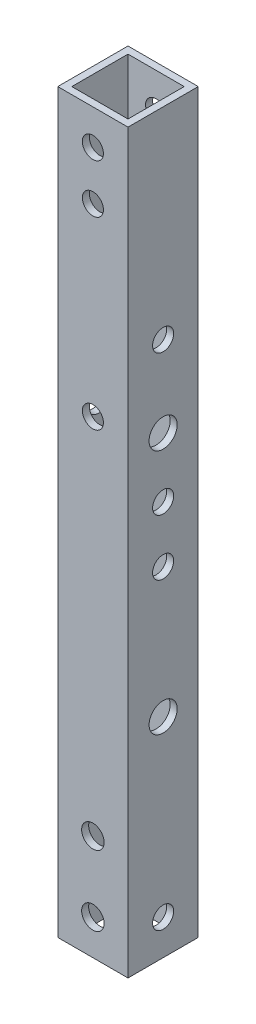
ISO-10303-21;
HEADER;
FILE_DESCRIPTION(('STEP AP214'),'2;1');
FILE_NAME('part.step','',(''),(''),'','','');
FILE_SCHEMA(('AUTOMOTIVE_DESIGN { 1 0 10303 214 1 1 1 1 }'));
ENDSEC;
DATA;
#1=APPLICATION_CONTEXT('core data for automotive mechanical design processes');
#2=APPLICATION_PROTOCOL_DEFINITION('international standard','automotive_design',2000,#1);
#3=PRODUCT_CONTEXT('',#1,'mechanical');
#4=PRODUCT('Part','Part','',(#3));
#5=PRODUCT_RELATED_PRODUCT_CATEGORY('part','',(#4));
#6=PRODUCT_DEFINITION_FORMATION('','',#4);
#7=PRODUCT_DEFINITION_CONTEXT('part definition',#1,'design');
#8=PRODUCT_DEFINITION('design','',#6,#7);
#9=PRODUCT_DEFINITION_SHAPE('','',#8);
#10=(LENGTH_UNIT() NAMED_UNIT(*) SI_UNIT(.MILLI.,.METRE.));
#11=(NAMED_UNIT(*) PLANE_ANGLE_UNIT() SI_UNIT($,.RADIAN.));
#12=(NAMED_UNIT(*) SI_UNIT($,.STERADIAN.) SOLID_ANGLE_UNIT());
#13=UNCERTAINTY_MEASURE_WITH_UNIT(LENGTH_MEASURE(1.E-05),#10,'distance_accuracy_value','');
#14=(GEOMETRIC_REPRESENTATION_CONTEXT(3) GLOBAL_UNCERTAINTY_ASSIGNED_CONTEXT((#13)) GLOBAL_UNIT_ASSIGNED_CONTEXT((#10,
#11,#12)) REPRESENTATION_CONTEXT('',''));
#15=CARTESIAN_POINT('',(0.,0.,0.));
#16=DIRECTION('',(0.,0.,1.));
#17=DIRECTION('',(1.,0.,0.));
#18=AXIS2_PLACEMENT_3D('',#15,#16,#17);
#19=CARTESIAN_POINT('',(0.,104.9,0.));
#20=DIRECTION('',(0.,1.,0.));
#21=DIRECTION('',(0.,0.,1.));
#22=AXIS2_PLACEMENT_3D('',#19,#20,#21);
#23=PLANE('',#22);
#24=DIRECTION('',(0.,0.,-1.));
#25=VECTOR('',#24,1.);
#26=CARTESIAN_POINT('',(5.,104.9,5.));
#27=LINE('',#26,#25);
#28=CARTESIAN_POINT('',(5.,104.9,5.));
#29=VERTEX_POINT('',#28);
#30=CARTESIAN_POINT('',(5.,104.9,-5.));
#31=VERTEX_POINT('',#30);
#32=EDGE_CURVE('E162',#29,#31,#27,.T.);
#33=ORIENTED_EDGE('',*,*,#32,.T.);
#34=DIRECTION('',(-1.,0.,0.));
#35=VECTOR('',#34,1.);
#36=CARTESIAN_POINT('',(-5.,104.9,-5.));
#37=LINE('',#36,#35);
#38=CARTESIAN_POINT('',(-5.,104.9,-5.));
#39=VERTEX_POINT('',#38);
#40=EDGE_CURVE('E165',#31,#39,#37,.T.);
#41=ORIENTED_EDGE('',*,*,#40,.T.);
#42=DIRECTION('',(0.,0.,1.));
#43=VECTOR('',#42,1.);
#44=CARTESIAN_POINT('',(-5.,104.9,5.));
#45=LINE('',#44,#43);
#46=CARTESIAN_POINT('',(-5.,104.9,5.));
#47=VERTEX_POINT('',#46);
#48=EDGE_CURVE('E168',#39,#47,#45,.T.);
#49=ORIENTED_EDGE('',*,*,#48,.T.);
#50=DIRECTION('',(1.,0.,0.));
#51=VECTOR('',#50,1.);
#52=CARTESIAN_POINT('',(-5.,104.9,5.));
#53=LINE('',#52,#51);
#54=EDGE_CURVE('E170',#47,#29,#53,.T.);
#55=ORIENTED_EDGE('',*,*,#54,.T.);
#56=EDGE_LOOP('',(#33,#41,#49,#55));
#57=FACE_BOUND('',#56,.T.);
#58=DIRECTION('',(-1.,0.,0.));
#59=VECTOR('',#58,1.);
#60=CARTESIAN_POINT('',(0.,104.9,-4.));
#61=LINE('',#60,#59);
#62=CARTESIAN_POINT('',(4.,104.9,-4.));
#63=VERTEX_POINT('',#62);
#64=CARTESIAN_POINT('',(-4.,104.9,-4.));
#65=VERTEX_POINT('',#64);
#66=EDGE_CURVE('E132',#63,#65,#61,.T.);
#67=ORIENTED_EDGE('',*,*,#66,.F.);
#68=DIRECTION('',(0.,0.,-1.));
#69=VECTOR('',#68,1.);
#70=CARTESIAN_POINT('',(4.,104.9,0.));
#71=LINE('',#70,#69);
#72=CARTESIAN_POINT('',(4.,104.9,4.));
#73=VERTEX_POINT('',#72);
#74=EDGE_CURVE('E124',#73,#63,#71,.T.);
#75=ORIENTED_EDGE('',*,*,#74,.F.);
#76=DIRECTION('',(1.,0.,0.));
#77=VECTOR('',#76,1.);
#78=CARTESIAN_POINT('',(0.,104.9,4.));
#79=LINE('',#78,#77);
#80=CARTESIAN_POINT('',(-4.,104.9,4.));
#81=VERTEX_POINT('',#80);
#82=EDGE_CURVE('E146',#81,#73,#79,.T.);
#83=ORIENTED_EDGE('',*,*,#82,.F.);
#84=DIRECTION('',(0.,0.,1.));
#85=VECTOR('',#84,1.);
#86=CARTESIAN_POINT('',(-4.,104.9,0.));
#87=LINE('',#86,#85);
#88=EDGE_CURVE('E144',#65,#81,#87,.T.);
#89=ORIENTED_EDGE('',*,*,#88,.F.);
#90=EDGE_LOOP('',(#67,#75,#83,#89));
#91=FACE_BOUND('',#90,.T.);
#92=ADVANCED_FACE('F57',(#57,#91),#23,.T.);
#93=CARTESIAN_POINT('',(0.,0.,0.));
#94=DIRECTION('',(0.,1.,0.));
#95=DIRECTION('',(0.,0.,1.));
#96=AXIS2_PLACEMENT_3D('',#93,#94,#95);
#97=PLANE('',#96);
#98=DIRECTION('',(0.,0.,-1.));
#99=VECTOR('',#98,1.);
#100=CARTESIAN_POINT('',(5.,0.,5.));
#101=LINE('',#100,#99);
#102=CARTESIAN_POINT('',(5.,0.,5.));
#103=VERTEX_POINT('',#102);
#104=CARTESIAN_POINT('',(5.,0.,-5.));
#105=VERTEX_POINT('',#104);
#106=EDGE_CURVE('E140',#103,#105,#101,.T.);
#107=ORIENTED_EDGE('',*,*,#106,.F.);
#108=DIRECTION('',(1.,0.,0.));
#109=VECTOR('',#108,1.);
#110=CARTESIAN_POINT('',(-5.,0.,5.));
#111=LINE('',#110,#109);
#112=CARTESIAN_POINT('',(-5.,0.,5.));
#113=VERTEX_POINT('',#112);
#114=EDGE_CURVE('E166',#113,#103,#111,.T.);
#115=ORIENTED_EDGE('',*,*,#114,.F.);
#116=DIRECTION('',(0.,0.,1.));
#117=VECTOR('',#116,1.);
#118=CARTESIAN_POINT('',(-5.,0.,5.));
#119=LINE('',#118,#117);
#120=CARTESIAN_POINT('',(-5.,0.,-5.));
#121=VERTEX_POINT('',#120);
#122=EDGE_CURVE('E177',#121,#113,#119,.T.);
#123=ORIENTED_EDGE('',*,*,#122,.F.);
#124=DIRECTION('',(-1.,0.,0.));
#125=VECTOR('',#124,1.);
#126=CARTESIAN_POINT('',(-5.,0.,-5.));
#127=LINE('',#126,#125);
#128=EDGE_CURVE('E175',#105,#121,#127,.T.);
#129=ORIENTED_EDGE('',*,*,#128,.F.);
#130=EDGE_LOOP('',(#107,#115,#123,#129));
#131=FACE_BOUND('',#130,.T.);
#132=DIRECTION('',(0.,0.,-1.));
#133=VECTOR('',#132,1.);
#134=CARTESIAN_POINT('',(4.,0.,0.));
#135=LINE('',#134,#133);
#136=CARTESIAN_POINT('',(4.,0.,4.));
#137=VERTEX_POINT('',#136);
#138=CARTESIAN_POINT('',(4.,0.,-4.));
#139=VERTEX_POINT('',#138);
#140=EDGE_CURVE('E82',#137,#139,#135,.T.);
#141=ORIENTED_EDGE('',*,*,#140,.T.);
#142=DIRECTION('',(-1.,0.,0.));
#143=VECTOR('',#142,1.);
#144=CARTESIAN_POINT('',(0.,0.,-4.));
#145=LINE('',#144,#143);
#146=CARTESIAN_POINT('',(-4.,0.,-4.));
#147=VERTEX_POINT('',#146);
#148=EDGE_CURVE('E139',#139,#147,#145,.T.);
#149=ORIENTED_EDGE('',*,*,#148,.T.);
#150=DIRECTION('',(0.,0.,1.));
#151=VECTOR('',#150,1.);
#152=CARTESIAN_POINT('',(-4.,0.,0.));
#153=LINE('',#152,#151);
#154=CARTESIAN_POINT('',(-4.,0.,4.));
#155=VERTEX_POINT('',#154);
#156=EDGE_CURVE('E154',#147,#155,#153,.T.);
#157=ORIENTED_EDGE('',*,*,#156,.T.);
#158=DIRECTION('',(1.,0.,0.));
#159=VECTOR('',#158,1.);
#160=CARTESIAN_POINT('',(0.,0.,4.));
#161=LINE('',#160,#159);
#162=EDGE_CURVE('E133',#155,#137,#161,.T.);
#163=ORIENTED_EDGE('',*,*,#162,.T.);
#164=EDGE_LOOP('',(#141,#149,#157,#163));
#165=FACE_BOUND('',#164,.T.);
#166=ADVANCED_FACE('F317',(#131,#165),#97,.F.);
#167=CARTESIAN_POINT('',(5.,104.9,5.));
#168=DIRECTION('',(-1.,0.,0.));
#169=DIRECTION('',(0.,0.,1.));
#170=AXIS2_PLACEMENT_3D('',#167,#168,#169);
#171=PLANE('',#170);
#172=CARTESIAN_POINT('',(5.,5.,0.));
#173=DIRECTION('',(1.,0.,0.));
#174=DIRECTION('',(0.,0.,-1.));
#175=AXIS2_PLACEMENT_3D('',#172,#173,#174);
#176=CIRCLE('',#175,1.5);
#177=CARTESIAN_POINT('',(5.,5.,-1.5));
#178=VERTEX_POINT('',#177);
#179=EDGE_CURVE('E369',#178,#178,#176,.T.);
#180=ORIENTED_EDGE('',*,*,#179,.F.);
#181=EDGE_LOOP('',(#180));
#182=FACE_BOUND('',#181,.T.);
#183=CARTESIAN_POINT('',(5.,29.7,0.));
#184=DIRECTION('',(1.,0.,0.));
#185=DIRECTION('',(0.,0.,-1.));
#186=AXIS2_PLACEMENT_3D('',#183,#184,#185);
#187=CIRCLE('',#186,2.);
#188=CARTESIAN_POINT('',(5.,29.7,-2.));
#189=VERTEX_POINT('',#188);
#190=EDGE_CURVE('E402',#189,#189,#187,.T.);
#191=ORIENTED_EDGE('',*,*,#190,.F.);
#192=EDGE_LOOP('',(#191));
#193=FACE_BOUND('',#192,.T.);
#194=CARTESIAN_POINT('',(5.,76.2,0.));
#195=DIRECTION('',(1.,0.,0.));
#196=DIRECTION('',(0.,0.,-1.));
#197=AXIS2_PLACEMENT_3D('',#194,#195,#196);
#198=CIRCLE('',#197,1.5);
#199=CARTESIAN_POINT('',(5.,76.2,-1.5));
#200=VERTEX_POINT('',#199);
#201=EDGE_CURVE('E406',#200,#200,#198,.T.);
#202=ORIENTED_EDGE('',*,*,#201,.F.);
#203=EDGE_LOOP('',(#202));
#204=FACE_BOUND('',#203,.T.);
#205=CARTESIAN_POINT('',(5.,48.2,0.));
#206=DIRECTION('',(1.,0.,0.));
#207=DIRECTION('',(0.,0.,-1.));
#208=AXIS2_PLACEMENT_3D('',#205,#206,#207);
#209=CIRCLE('',#208,1.5);
#210=CARTESIAN_POINT('',(5.,48.2,-1.5));
#211=VERTEX_POINT('',#210);
#212=EDGE_CURVE('E410',#211,#211,#209,.T.);
#213=ORIENTED_EDGE('',*,*,#212,.F.);
#214=EDGE_LOOP('',(#213));
#215=FACE_BOUND('',#214,.T.);
#216=CARTESIAN_POINT('',(5.,56.2,0.));
#217=DIRECTION('',(1.,0.,0.));
#218=DIRECTION('',(0.,0.,-1.));
#219=AXIS2_PLACEMENT_3D('',#216,#217,#218);
#220=CIRCLE('',#219,1.5);
#221=CARTESIAN_POINT('',(5.,56.2,-1.5));
#222=VERTEX_POINT('',#221);
#223=EDGE_CURVE('E413',#222,#222,#220,.T.);
#224=ORIENTED_EDGE('',*,*,#223,.F.);
#225=EDGE_LOOP('',(#224));
#226=FACE_BOUND('',#225,.T.);
#227=CARTESIAN_POINT('',(5.,64.7,0.));
#228=DIRECTION('',(1.,0.,0.));
#229=DIRECTION('',(0.,0.,-1.));
#230=AXIS2_PLACEMENT_3D('',#227,#228,#229);
#231=CIRCLE('',#230,2.);
#232=CARTESIAN_POINT('',(5.,64.7,-2.));
#233=VERTEX_POINT('',#232);
#234=EDGE_CURVE('E364',#233,#233,#231,.T.);
#235=ORIENTED_EDGE('',*,*,#234,.F.);
#236=EDGE_LOOP('',(#235));
#237=FACE_BOUND('',#236,.T.);
#238=ORIENTED_EDGE('',*,*,#106,.T.);
#239=DIRECTION('',(0.,-1.,0.));
#240=VECTOR('',#239,1.);
#241=CARTESIAN_POINT('',(5.,104.9,-5.));
#242=LINE('',#241,#240);
#243=EDGE_CURVE('E12',#31,#105,#242,.T.);
#244=ORIENTED_EDGE('',*,*,#243,.F.);
#245=ORIENTED_EDGE('',*,*,#32,.F.);
#246=DIRECTION('',(0.,-1.,0.));
#247=VECTOR('',#246,1.);
#248=CARTESIAN_POINT('',(5.,104.9,5.));
#249=LINE('',#248,#247);
#250=EDGE_CURVE('E172',#29,#103,#249,.T.);
#251=ORIENTED_EDGE('',*,*,#250,.T.);
#252=EDGE_LOOP('',(#238,#244,#245,#251));
#253=FACE_BOUND('',#252,.T.);
#254=ADVANCED_FACE('F59',(#182,#193,#204,#215,#226,#237,#253),#171,.F.);
#255=CARTESIAN_POINT('',(-5.,104.9,-5.));
#256=DIRECTION('',(0.,0.,1.));
#257=DIRECTION('',(1.,0.,0.));
#258=AXIS2_PLACEMENT_3D('',#255,#256,#257);
#259=PLANE('',#258);
#260=CARTESIAN_POINT('',(0.,5.,-5.));
#261=DIRECTION('',(0.,0.,1.));
#262=DIRECTION('',(1.,0.,0.));
#263=AXIS2_PLACEMENT_3D('',#260,#261,#262);
#264=CIRCLE('',#263,1.6);
#265=CARTESIAN_POINT('',(1.6,5.,-5.));
#266=VERTEX_POINT('',#265);
#267=EDGE_CURVE('E253',#266,#266,#264,.T.);
#268=ORIENTED_EDGE('',*,*,#267,.T.);
#269=EDGE_LOOP('',(#268));
#270=FACE_BOUND('',#269,.T.);
#271=CARTESIAN_POINT('',(0.,66.7,-5.));
#272=DIRECTION('',(0.,0.,1.));
#273=DIRECTION('',(1.,0.,0.));
#274=AXIS2_PLACEMENT_3D('',#271,#272,#273);
#275=CIRCLE('',#274,1.5);
#276=CARTESIAN_POINT('',(1.5,66.7,-5.));
#277=VERTEX_POINT('',#276);
#278=EDGE_CURVE('E260',#277,#277,#275,.T.);
#279=ORIENTED_EDGE('',*,*,#278,.T.);
#280=EDGE_LOOP('',(#279));
#281=FACE_BOUND('',#280,.T.);
#282=CARTESIAN_POINT('',(0.,99.9,-5.));
#283=DIRECTION('',(0.,0.,1.));
#284=DIRECTION('',(1.,0.,0.));
#285=AXIS2_PLACEMENT_3D('',#282,#283,#284);
#286=CIRCLE('',#285,1.5);
#287=CARTESIAN_POINT('',(1.5,99.9,-5.));
#288=VERTEX_POINT('',#287);
#289=EDGE_CURVE('E241',#288,#288,#286,.T.);
#290=ORIENTED_EDGE('',*,*,#289,.T.);
#291=EDGE_LOOP('',(#290));
#292=FACE_BOUND('',#291,.T.);
#293=CARTESIAN_POINT('',(0.,15.,-5.));
#294=DIRECTION('',(0.,0.,1.));
#295=DIRECTION('',(1.,0.,0.));
#296=AXIS2_PLACEMENT_3D('',#293,#294,#295);
#297=CIRCLE('',#296,1.6);
#298=CARTESIAN_POINT('',(1.6,15.,-5.));
#299=VERTEX_POINT('',#298);
#300=EDGE_CURVE('E248',#299,#299,#297,.T.);
#301=ORIENTED_EDGE('',*,*,#300,.T.);
#302=EDGE_LOOP('',(#301));
#303=FACE_BOUND('',#302,.T.);
#304=CARTESIAN_POINT('',(0.,92.95,-5.));
#305=DIRECTION('',(0.,0.,1.));
#306=DIRECTION('',(1.,0.,0.));
#307=AXIS2_PLACEMENT_3D('',#304,#305,#306);
#308=CIRCLE('',#307,1.5);
#309=CARTESIAN_POINT('',(1.5,92.95,-5.));
#310=VERTEX_POINT('',#309);
#311=EDGE_CURVE('E191',#310,#310,#308,.T.);
#312=ORIENTED_EDGE('',*,*,#311,.T.);
#313=EDGE_LOOP('',(#312));
#314=FACE_BOUND('',#313,.T.);
#315=ORIENTED_EDGE('',*,*,#128,.T.);
#316=DIRECTION('',(0.,-1.,0.));
#317=VECTOR('',#316,1.);
#318=CARTESIAN_POINT('',(-5.,104.9,-5.));
#319=LINE('',#318,#317);
#320=EDGE_CURVE('E66',#39,#121,#319,.T.);
#321=ORIENTED_EDGE('',*,*,#320,.F.);
#322=ORIENTED_EDGE('',*,*,#40,.F.);
#323=ORIENTED_EDGE('',*,*,#243,.T.);
#324=EDGE_LOOP('',(#315,#321,#322,#323));
#325=FACE_BOUND('',#324,.T.);
#326=ADVANCED_FACE('F303',(#270,#281,#292,#303,#314,#325),#259,.F.);
#327=CARTESIAN_POINT('',(-5.,104.9,5.));
#328=DIRECTION('',(1.,0.,0.));
#329=DIRECTION('',(0.,0.,-1.));
#330=AXIS2_PLACEMENT_3D('',#327,#328,#329);
#331=PLANE('',#330);
#332=CARTESIAN_POINT('',(-5.,5.,0.));
#333=DIRECTION('',(1.,0.,0.));
#334=DIRECTION('',(0.,0.,-1.));
#335=AXIS2_PLACEMENT_3D('',#332,#333,#334);
#336=CIRCLE('',#335,1.5);
#337=CARTESIAN_POINT('',(-5.,5.,-1.5));
#338=VERTEX_POINT('',#337);
#339=EDGE_CURVE('E344',#338,#338,#336,.T.);
#340=ORIENTED_EDGE('',*,*,#339,.T.);
#341=EDGE_LOOP('',(#340));
#342=FACE_BOUND('',#341,.T.);
#343=CARTESIAN_POINT('',(-5.,29.7,0.));
#344=DIRECTION('',(1.,0.,0.));
#345=DIRECTION('',(0.,0.,-1.));
#346=AXIS2_PLACEMENT_3D('',#343,#344,#345);
#347=CIRCLE('',#346,2.);
#348=CARTESIAN_POINT('',(-5.,29.7,-2.));
#349=VERTEX_POINT('',#348);
#350=EDGE_CURVE('E348',#349,#349,#347,.T.);
#351=ORIENTED_EDGE('',*,*,#350,.T.);
#352=EDGE_LOOP('',(#351));
#353=FACE_BOUND('',#352,.T.);
#354=CARTESIAN_POINT('',(-5.,76.2,0.));
#355=DIRECTION('',(1.,0.,0.));
#356=DIRECTION('',(0.,0.,-1.));
#357=AXIS2_PLACEMENT_3D('',#354,#355,#356);
#358=CIRCLE('',#357,1.5);
#359=CARTESIAN_POINT('',(-5.,76.2,-1.5));
#360=VERTEX_POINT('',#359);
#361=EDGE_CURVE('E352',#360,#360,#358,.T.);
#362=ORIENTED_EDGE('',*,*,#361,.T.);
#363=EDGE_LOOP('',(#362));
#364=FACE_BOUND('',#363,.T.);
#365=CARTESIAN_POINT('',(-5.,48.2,0.));
#366=DIRECTION('',(1.,0.,0.));
#367=DIRECTION('',(0.,0.,-1.));
#368=AXIS2_PLACEMENT_3D('',#365,#366,#367);
#369=CIRCLE('',#368,1.5);
#370=CARTESIAN_POINT('',(-5.,48.2,-1.5));
#371=VERTEX_POINT('',#370);
#372=EDGE_CURVE('E356',#371,#371,#369,.T.);
#373=ORIENTED_EDGE('',*,*,#372,.T.);
#374=EDGE_LOOP('',(#373));
#375=FACE_BOUND('',#374,.T.);
#376=CARTESIAN_POINT('',(-5.,56.2,0.));
#377=DIRECTION('',(1.,0.,0.));
#378=DIRECTION('',(0.,0.,-1.));
#379=AXIS2_PLACEMENT_3D('',#376,#377,#378);
#380=CIRCLE('',#379,1.5);
#381=CARTESIAN_POINT('',(-5.,56.2,-1.5));
#382=VERTEX_POINT('',#381);
#383=EDGE_CURVE('E360',#382,#382,#380,.T.);
#384=ORIENTED_EDGE('',*,*,#383,.T.);
#385=EDGE_LOOP('',(#384));
#386=FACE_BOUND('',#385,.T.);
#387=CARTESIAN_POINT('',(-5.,64.7,0.));
#388=DIRECTION('',(1.,0.,0.));
#389=DIRECTION('',(0.,0.,-1.));
#390=AXIS2_PLACEMENT_3D('',#387,#388,#389);
#391=CIRCLE('',#390,2.);
#392=CARTESIAN_POINT('',(-5.,64.7,-2.));
#393=VERTEX_POINT('',#392);
#394=EDGE_CURVE('E211',#393,#393,#391,.T.);
#395=ORIENTED_EDGE('',*,*,#394,.T.);
#396=EDGE_LOOP('',(#395));
#397=FACE_BOUND('',#396,.T.);
#398=ORIENTED_EDGE('',*,*,#122,.T.);
#399=DIRECTION('',(0.,-1.,0.));
#400=VECTOR('',#399,1.);
#401=CARTESIAN_POINT('',(-5.,104.9,5.));
#402=LINE('',#401,#400);
#403=EDGE_CURVE('E182',#47,#113,#402,.T.);
#404=ORIENTED_EDGE('',*,*,#403,.F.);
#405=ORIENTED_EDGE('',*,*,#48,.F.);
#406=ORIENTED_EDGE('',*,*,#320,.T.);
#407=EDGE_LOOP('',(#398,#404,#405,#406));
#408=FACE_BOUND('',#407,.T.);
#409=ADVANCED_FACE('F306',(#342,#353,#364,#375,#386,#397,#408),#331,.F.);
#410=CARTESIAN_POINT('',(-5.,104.9,5.));
#411=DIRECTION('',(0.,0.,-1.));
#412=DIRECTION('',(-1.,0.,0.));
#413=AXIS2_PLACEMENT_3D('',#410,#411,#412);
#414=PLANE('',#413);
#415=CARTESIAN_POINT('',(0.,5.,5.));
#416=DIRECTION('',(0.,0.,1.));
#417=DIRECTION('',(1.,0.,0.));
#418=AXIS2_PLACEMENT_3D('',#415,#416,#417);
#419=CIRCLE('',#418,1.6);
#420=CARTESIAN_POINT('',(1.6,5.,5.));
#421=VERTEX_POINT('',#420);
#422=EDGE_CURVE('E257',#421,#421,#419,.T.);
#423=ORIENTED_EDGE('',*,*,#422,.F.);
#424=EDGE_LOOP('',(#423));
#425=FACE_BOUND('',#424,.T.);
#426=CARTESIAN_POINT('',(0.,66.7,5.));
#427=DIRECTION('',(0.,0.,1.));
#428=DIRECTION('',(1.,0.,0.));
#429=AXIS2_PLACEMENT_3D('',#426,#427,#428);
#430=CIRCLE('',#429,1.5);
#431=CARTESIAN_POINT('',(1.5,66.7,5.));
#432=VERTEX_POINT('',#431);
#433=EDGE_CURVE('E244',#432,#432,#430,.T.);
#434=ORIENTED_EDGE('',*,*,#433,.F.);
#435=EDGE_LOOP('',(#434));
#436=FACE_BOUND('',#435,.T.);
#437=CARTESIAN_POINT('',(0.,99.9,5.));
#438=DIRECTION('',(0.,0.,1.));
#439=DIRECTION('',(1.,0.,0.));
#440=AXIS2_PLACEMENT_3D('',#437,#438,#439);
#441=CIRCLE('',#440,1.5);
#442=CARTESIAN_POINT('',(1.5,99.9,5.));
#443=VERTEX_POINT('',#442);
#444=EDGE_CURVE('E245',#443,#443,#441,.T.);
#445=ORIENTED_EDGE('',*,*,#444,.F.);
#446=EDGE_LOOP('',(#445));
#447=FACE_BOUND('',#446,.T.);
#448=CARTESIAN_POINT('',(0.,15.,5.));
#449=DIRECTION('',(0.,0.,1.));
#450=DIRECTION('',(1.,0.,0.));
#451=AXIS2_PLACEMENT_3D('',#448,#449,#450);
#452=CIRCLE('',#451,1.6);
#453=CARTESIAN_POINT('',(1.6,15.,5.));
#454=VERTEX_POINT('',#453);
#455=EDGE_CURVE('E240',#454,#454,#452,.T.);
#456=ORIENTED_EDGE('',*,*,#455,.F.);
#457=EDGE_LOOP('',(#456));
#458=FACE_BOUND('',#457,.T.);
#459=CARTESIAN_POINT('',(0.,92.95,5.));
#460=DIRECTION('',(0.,0.,1.));
#461=DIRECTION('',(1.,0.,0.));
#462=AXIS2_PLACEMENT_3D('',#459,#460,#461);
#463=CIRCLE('',#462,1.5);
#464=CARTESIAN_POINT('',(1.5,92.95,5.));
#465=VERTEX_POINT('',#464);
#466=EDGE_CURVE('E256',#465,#465,#463,.T.);
#467=ORIENTED_EDGE('',*,*,#466,.F.);
#468=EDGE_LOOP('',(#467));
#469=FACE_BOUND('',#468,.T.);
#470=ORIENTED_EDGE('',*,*,#114,.T.);
#471=ORIENTED_EDGE('',*,*,#250,.F.);
#472=ORIENTED_EDGE('',*,*,#54,.F.);
#473=ORIENTED_EDGE('',*,*,#403,.T.);
#474=EDGE_LOOP('',(#470,#471,#472,#473));
#475=FACE_BOUND('',#474,.T.);
#476=ADVANCED_FACE('F321',(#425,#436,#447,#458,#469,#475),#414,.F.);
#477=CARTESIAN_POINT('',(4.,104.9,0.));
#478=DIRECTION('',(-1.,0.,0.));
#479=DIRECTION('',(0.,0.,1.));
#480=AXIS2_PLACEMENT_3D('',#477,#478,#479);
#481=PLANE('',#480);
#482=CARTESIAN_POINT('',(4.,5.,0.));
#483=DIRECTION('',(-1.,0.,0.));
#484=DIRECTION('',(0.,0.,1.));
#485=AXIS2_PLACEMENT_3D('',#482,#483,#484);
#486=CIRCLE('',#485,1.5);
#487=CARTESIAN_POINT('',(4.,5.,1.5));
#488=VERTEX_POINT('',#487);
#489=EDGE_CURVE('E237',#488,#488,#486,.T.);
#490=ORIENTED_EDGE('',*,*,#489,.F.);
#491=EDGE_LOOP('',(#490));
#492=FACE_BOUND('',#491,.T.);
#493=CARTESIAN_POINT('',(4.,29.7,0.));
#494=DIRECTION('',(-1.,0.,0.));
#495=DIRECTION('',(0.,0.,1.));
#496=AXIS2_PLACEMENT_3D('',#493,#494,#495);
#497=CIRCLE('',#496,2.);
#498=CARTESIAN_POINT('',(4.,29.7,2.));
#499=VERTEX_POINT('',#498);
#500=EDGE_CURVE('E225',#499,#499,#497,.T.);
#501=ORIENTED_EDGE('',*,*,#500,.F.);
#502=EDGE_LOOP('',(#501));
#503=FACE_BOUND('',#502,.T.);
#504=CARTESIAN_POINT('',(4.,76.2,0.));
#505=DIRECTION('',(-1.,0.,0.));
#506=DIRECTION('',(0.,0.,1.));
#507=AXIS2_PLACEMENT_3D('',#504,#505,#506);
#508=CIRCLE('',#507,1.5);
#509=CARTESIAN_POINT('',(4.,76.2,1.5));
#510=VERTEX_POINT('',#509);
#511=EDGE_CURVE('E222',#510,#510,#508,.T.);
#512=ORIENTED_EDGE('',*,*,#511,.F.);
#513=EDGE_LOOP('',(#512));
#514=FACE_BOUND('',#513,.T.);
#515=CARTESIAN_POINT('',(4.,48.2,0.));
#516=DIRECTION('',(-1.,0.,0.));
#517=DIRECTION('',(0.,0.,1.));
#518=AXIS2_PLACEMENT_3D('',#515,#516,#517);
#519=CIRCLE('',#518,1.5);
#520=CARTESIAN_POINT('',(4.,48.2,1.5));
#521=VERTEX_POINT('',#520);
#522=EDGE_CURVE('E219',#521,#521,#519,.T.);
#523=ORIENTED_EDGE('',*,*,#522,.F.);
#524=EDGE_LOOP('',(#523));
#525=FACE_BOUND('',#524,.T.);
#526=CARTESIAN_POINT('',(4.,56.2,0.));
#527=DIRECTION('',(-1.,0.,0.));
#528=DIRECTION('',(0.,0.,1.));
#529=AXIS2_PLACEMENT_3D('',#526,#527,#528);
#530=CIRCLE('',#529,1.5);
#531=CARTESIAN_POINT('',(4.,56.2,1.5));
#532=VERTEX_POINT('',#531);
#533=EDGE_CURVE('E215',#532,#532,#530,.T.);
#534=ORIENTED_EDGE('',*,*,#533,.F.);
#535=EDGE_LOOP('',(#534));
#536=FACE_BOUND('',#535,.T.);
#537=CARTESIAN_POINT('',(4.,64.7,0.));
#538=DIRECTION('',(-1.,0.,0.));
#539=DIRECTION('',(0.,0.,1.));
#540=AXIS2_PLACEMENT_3D('',#537,#538,#539);
#541=CIRCLE('',#540,2.);
#542=CARTESIAN_POINT('',(4.,64.7,2.));
#543=VERTEX_POINT('',#542);
#544=EDGE_CURVE('E210',#543,#543,#541,.T.);
#545=ORIENTED_EDGE('',*,*,#544,.F.);
#546=EDGE_LOOP('',(#545));
#547=FACE_BOUND('',#546,.T.);
#548=ORIENTED_EDGE('',*,*,#140,.F.);
#549=DIRECTION('',(0.,-1.,0.));
#550=VECTOR('',#549,1.);
#551=CARTESIAN_POINT('',(4.,104.9,4.));
#552=LINE('',#551,#550);
#553=EDGE_CURVE('E128',#73,#137,#552,.T.);
#554=ORIENTED_EDGE('',*,*,#553,.F.);
#555=ORIENTED_EDGE('',*,*,#74,.T.);
#556=DIRECTION('',(0.,-1.,0.));
#557=VECTOR('',#556,1.);
#558=CARTESIAN_POINT('',(4.,104.9,-4.));
#559=LINE('',#558,#557);
#560=EDGE_CURVE('E127',#63,#139,#559,.T.);
#561=ORIENTED_EDGE('',*,*,#560,.T.);
#562=EDGE_LOOP('',(#548,#554,#555,#561));
#563=FACE_BOUND('',#562,.T.);
#564=ADVANCED_FACE('F126',(#492,#503,#514,#525,#536,#547,#563),#481,.T.);
#565=CARTESIAN_POINT('',(0.,104.9,-4.));
#566=DIRECTION('',(0.,0.,1.));
#567=DIRECTION('',(1.,0.,0.));
#568=AXIS2_PLACEMENT_3D('',#565,#566,#567);
#569=PLANE('',#568);
#570=CARTESIAN_POINT('',(0.,5.,-4.));
#571=DIRECTION('',(0.,0.,1.));
#572=DIRECTION('',(1.,0.,0.));
#573=AXIS2_PLACEMENT_3D('',#570,#571,#572);
#574=CIRCLE('',#573,1.6);
#575=CARTESIAN_POINT('',(1.6,5.,-4.));
#576=VERTEX_POINT('',#575);
#577=EDGE_CURVE('E152',#576,#576,#574,.T.);
#578=ORIENTED_EDGE('',*,*,#577,.F.);
#579=EDGE_LOOP('',(#578));
#580=FACE_BOUND('',#579,.T.);
#581=CARTESIAN_POINT('',(0.,66.7,-4.));
#582=DIRECTION('',(0.,0.,1.));
#583=DIRECTION('',(1.,0.,0.));
#584=AXIS2_PLACEMENT_3D('',#581,#582,#583);
#585=CIRCLE('',#584,1.5);
#586=CARTESIAN_POINT('',(1.5,66.7,-4.));
#587=VERTEX_POINT('',#586);
#588=EDGE_CURVE('E203',#587,#587,#585,.T.);
#589=ORIENTED_EDGE('',*,*,#588,.F.);
#590=EDGE_LOOP('',(#589));
#591=FACE_BOUND('',#590,.T.);
#592=CARTESIAN_POINT('',(0.,99.9,-4.));
#593=DIRECTION('',(0.,0.,1.));
#594=DIRECTION('',(1.,0.,0.));
#595=AXIS2_PLACEMENT_3D('',#592,#593,#594);
#596=CIRCLE('',#595,1.5);
#597=CARTESIAN_POINT('',(1.5,99.9,-4.));
#598=VERTEX_POINT('',#597);
#599=EDGE_CURVE('E199',#598,#598,#596,.T.);
#600=ORIENTED_EDGE('',*,*,#599,.F.);
#601=EDGE_LOOP('',(#600));
#602=FACE_BOUND('',#601,.T.);
#603=CARTESIAN_POINT('',(0.,15.,-4.));
#604=DIRECTION('',(0.,0.,1.));
#605=DIRECTION('',(1.,0.,0.));
#606=AXIS2_PLACEMENT_3D('',#603,#604,#605);
#607=CIRCLE('',#606,1.6);
#608=CARTESIAN_POINT('',(1.6,15.,-4.));
#609=VERTEX_POINT('',#608);
#610=EDGE_CURVE('E195',#609,#609,#607,.T.);
#611=ORIENTED_EDGE('',*,*,#610,.F.);
#612=EDGE_LOOP('',(#611));
#613=FACE_BOUND('',#612,.T.);
#614=CARTESIAN_POINT('',(0.,92.95,-4.));
#615=DIRECTION('',(0.,0.,1.));
#616=DIRECTION('',(1.,0.,0.));
#617=AXIS2_PLACEMENT_3D('',#614,#615,#616);
#618=CIRCLE('',#617,1.5);
#619=CARTESIAN_POINT('',(1.5,92.95,-4.));
#620=VERTEX_POINT('',#619);
#621=EDGE_CURVE('E190',#620,#620,#618,.T.);
#622=ORIENTED_EDGE('',*,*,#621,.F.);
#623=EDGE_LOOP('',(#622));
#624=FACE_BOUND('',#623,.T.);
#625=ORIENTED_EDGE('',*,*,#148,.F.);
#626=ORIENTED_EDGE('',*,*,#560,.F.);
#627=ORIENTED_EDGE('',*,*,#66,.T.);
#628=DIRECTION('',(0.,-1.,0.));
#629=VECTOR('',#628,1.);
#630=CARTESIAN_POINT('',(-4.,104.9,-4.));
#631=LINE('',#630,#629);
#632=EDGE_CURVE('E141',#65,#147,#631,.T.);
#633=ORIENTED_EDGE('',*,*,#632,.T.);
#634=EDGE_LOOP('',(#625,#626,#627,#633));
#635=FACE_BOUND('',#634,.T.);
#636=ADVANCED_FACE('F136',(#580,#591,#602,#613,#624,#635),#569,.T.);
#637=CARTESIAN_POINT('',(-4.,104.9,0.));
#638=DIRECTION('',(1.,0.,0.));
#639=DIRECTION('',(0.,0.,-1.));
#640=AXIS2_PLACEMENT_3D('',#637,#638,#639);
#641=PLANE('',#640);
#642=CARTESIAN_POINT('',(-4.,5.,0.));
#643=DIRECTION('',(1.,0.,0.));
#644=DIRECTION('',(0.,0.,-1.));
#645=AXIS2_PLACEMENT_3D('',#642,#643,#644);
#646=CIRCLE('',#645,1.5);
#647=CARTESIAN_POINT('',(-4.,5.,-1.5));
#648=VERTEX_POINT('',#647);
#649=EDGE_CURVE('E61',#648,#648,#646,.T.);
#650=ORIENTED_EDGE('',*,*,#649,.F.);
#651=EDGE_LOOP('',(#650));
#652=FACE_BOUND('',#651,.T.);
#653=CARTESIAN_POINT('',(-4.,29.7,0.));
#654=DIRECTION('',(1.,0.,0.));
#655=DIRECTION('',(0.,0.,-1.));
#656=AXIS2_PLACEMENT_3D('',#653,#654,#655);
#657=CIRCLE('',#656,2.);
#658=CARTESIAN_POINT('',(-4.,29.7,-2.));
#659=VERTEX_POINT('',#658);
#660=EDGE_CURVE('E223',#659,#659,#657,.T.);
#661=ORIENTED_EDGE('',*,*,#660,.F.);
#662=EDGE_LOOP('',(#661));
#663=FACE_BOUND('',#662,.T.);
#664=CARTESIAN_POINT('',(-4.,76.2,0.));
#665=DIRECTION('',(1.,0.,0.));
#666=DIRECTION('',(0.,0.,-1.));
#667=AXIS2_PLACEMENT_3D('',#664,#665,#666);
#668=CIRCLE('',#667,1.5);
#669=CARTESIAN_POINT('',(-4.,76.2,-1.5));
#670=VERTEX_POINT('',#669);
#671=EDGE_CURVE('E220',#670,#670,#668,.T.);
#672=ORIENTED_EDGE('',*,*,#671,.F.);
#673=EDGE_LOOP('',(#672));
#674=FACE_BOUND('',#673,.T.);
#675=CARTESIAN_POINT('',(-4.,48.2,0.));
#676=DIRECTION('',(1.,0.,0.));
#677=DIRECTION('',(0.,0.,-1.));
#678=AXIS2_PLACEMENT_3D('',#675,#676,#677);
#679=CIRCLE('',#678,1.5);
#680=CARTESIAN_POINT('',(-4.,48.2,-1.5));
#681=VERTEX_POINT('',#680);
#682=EDGE_CURVE('E216',#681,#681,#679,.T.);
#683=ORIENTED_EDGE('',*,*,#682,.F.);
#684=EDGE_LOOP('',(#683));
#685=FACE_BOUND('',#684,.T.);
#686=CARTESIAN_POINT('',(-4.,56.2,0.));
#687=DIRECTION('',(1.,0.,0.));
#688=DIRECTION('',(0.,0.,-1.));
#689=AXIS2_PLACEMENT_3D('',#686,#687,#688);
#690=CIRCLE('',#689,1.5);
#691=CARTESIAN_POINT('',(-4.,56.2,-1.5));
#692=VERTEX_POINT('',#691);
#693=EDGE_CURVE('E212',#692,#692,#690,.T.);
#694=ORIENTED_EDGE('',*,*,#693,.F.);
#695=EDGE_LOOP('',(#694));
#696=FACE_BOUND('',#695,.T.);
#697=CARTESIAN_POINT('',(-4.,64.7,0.));
#698=DIRECTION('',(1.,0.,0.));
#699=DIRECTION('',(0.,0.,-1.));
#700=AXIS2_PLACEMENT_3D('',#697,#698,#699);
#701=CIRCLE('',#700,2.);
#702=CARTESIAN_POINT('',(-4.,64.7,-2.));
#703=VERTEX_POINT('',#702);
#704=EDGE_CURVE('E207',#703,#703,#701,.T.);
#705=ORIENTED_EDGE('',*,*,#704,.F.);
#706=EDGE_LOOP('',(#705));
#707=FACE_BOUND('',#706,.T.);
#708=ORIENTED_EDGE('',*,*,#156,.F.);
#709=ORIENTED_EDGE('',*,*,#632,.F.);
#710=ORIENTED_EDGE('',*,*,#88,.T.);
#711=DIRECTION('',(0.,-1.,0.));
#712=VECTOR('',#711,1.);
#713=CARTESIAN_POINT('',(-4.,104.9,4.));
#714=LINE('',#713,#712);
#715=EDGE_CURVE('E74',#81,#155,#714,.T.);
#716=ORIENTED_EDGE('',*,*,#715,.T.);
#717=EDGE_LOOP('',(#708,#709,#710,#716));
#718=FACE_BOUND('',#717,.T.);
#719=ADVANCED_FACE('F284',(#652,#663,#674,#685,#696,#707,#718),#641,.T.);
#720=CARTESIAN_POINT('',(0.,104.9,4.));
#721=DIRECTION('',(0.,0.,-1.));
#722=DIRECTION('',(-1.,0.,0.));
#723=AXIS2_PLACEMENT_3D('',#720,#721,#722);
#724=PLANE('',#723);
#725=CARTESIAN_POINT('',(0.,5.,4.));
#726=DIRECTION('',(0.,0.,-1.));
#727=DIRECTION('',(-1.,0.,0.));
#728=AXIS2_PLACEMENT_3D('',#725,#726,#727);
#729=CIRCLE('',#728,1.6);
#730=CARTESIAN_POINT('',(-1.6,5.,4.));
#731=VERTEX_POINT('',#730);
#732=EDGE_CURVE('E204',#731,#731,#729,.T.);
#733=ORIENTED_EDGE('',*,*,#732,.F.);
#734=EDGE_LOOP('',(#733));
#735=FACE_BOUND('',#734,.T.);
#736=CARTESIAN_POINT('',(0.,66.7,4.));
#737=DIRECTION('',(0.,0.,-1.));
#738=DIRECTION('',(-1.,0.,0.));
#739=AXIS2_PLACEMENT_3D('',#736,#737,#738);
#740=CIRCLE('',#739,1.5);
#741=CARTESIAN_POINT('',(-1.5,66.7,4.));
#742=VERTEX_POINT('',#741);
#743=EDGE_CURVE('E200',#742,#742,#740,.T.);
#744=ORIENTED_EDGE('',*,*,#743,.F.);
#745=EDGE_LOOP('',(#744));
#746=FACE_BOUND('',#745,.T.);
#747=CARTESIAN_POINT('',(0.,99.9,4.));
#748=DIRECTION('',(0.,0.,-1.));
#749=DIRECTION('',(-1.,0.,0.));
#750=AXIS2_PLACEMENT_3D('',#747,#748,#749);
#751=CIRCLE('',#750,1.5);
#752=CARTESIAN_POINT('',(-1.5,99.9,4.));
#753=VERTEX_POINT('',#752);
#754=EDGE_CURVE('E196',#753,#753,#751,.T.);
#755=ORIENTED_EDGE('',*,*,#754,.F.);
#756=EDGE_LOOP('',(#755));
#757=FACE_BOUND('',#756,.T.);
#758=CARTESIAN_POINT('',(0.,15.,4.));
#759=DIRECTION('',(0.,0.,-1.));
#760=DIRECTION('',(-1.,0.,0.));
#761=AXIS2_PLACEMENT_3D('',#758,#759,#760);
#762=CIRCLE('',#761,1.6);
#763=CARTESIAN_POINT('',(-1.6,15.,4.));
#764=VERTEX_POINT('',#763);
#765=EDGE_CURVE('E192',#764,#764,#762,.T.);
#766=ORIENTED_EDGE('',*,*,#765,.F.);
#767=EDGE_LOOP('',(#766));
#768=FACE_BOUND('',#767,.T.);
#769=CARTESIAN_POINT('',(0.,92.95,4.));
#770=DIRECTION('',(0.,0.,-1.));
#771=DIRECTION('',(-1.,0.,0.));
#772=AXIS2_PLACEMENT_3D('',#769,#770,#771);
#773=CIRCLE('',#772,1.5);
#774=CARTESIAN_POINT('',(-1.5,92.95,4.));
#775=VERTEX_POINT('',#774);
#776=EDGE_CURVE('E187',#775,#775,#773,.T.);
#777=ORIENTED_EDGE('',*,*,#776,.F.);
#778=EDGE_LOOP('',(#777));
#779=FACE_BOUND('',#778,.T.);
#780=ORIENTED_EDGE('',*,*,#162,.F.);
#781=ORIENTED_EDGE('',*,*,#715,.F.);
#782=ORIENTED_EDGE('',*,*,#82,.T.);
#783=ORIENTED_EDGE('',*,*,#553,.T.);
#784=EDGE_LOOP('',(#780,#781,#782,#783));
#785=FACE_BOUND('',#784,.T.);
#786=ADVANCED_FACE('F454',(#735,#746,#757,#768,#779,#785),#724,.T.);
#787=CARTESIAN_POINT('',(0.,92.95,-5.));
#788=DIRECTION('',(0.,0.,1.));
#789=DIRECTION('',(1.,0.,0.));
#790=AXIS2_PLACEMENT_3D('',#787,#788,#789);
#791=CYLINDRICAL_SURFACE('',#790,1.5);
#792=ORIENTED_EDGE('',*,*,#776,.T.);
#793=EDGE_LOOP('',(#792));
#794=FACE_BOUND('',#793,.T.);
#795=ORIENTED_EDGE('',*,*,#466,.T.);
#796=EDGE_LOOP('',(#795));
#797=FACE_BOUND('',#796,.T.);
#798=ADVANCED_FACE('F300',(#794,#797),#791,.F.);
#799=CARTESIAN_POINT('',(0.,15.,-5.));
#800=DIRECTION('',(0.,0.,1.));
#801=DIRECTION('',(1.,0.,0.));
#802=AXIS2_PLACEMENT_3D('',#799,#800,#801);
#803=CYLINDRICAL_SURFACE('',#802,1.6);
#804=ORIENTED_EDGE('',*,*,#765,.T.);
#805=EDGE_LOOP('',(#804));
#806=FACE_BOUND('',#805,.T.);
#807=ORIENTED_EDGE('',*,*,#455,.T.);
#808=EDGE_LOOP('',(#807));
#809=FACE_BOUND('',#808,.T.);
#810=ADVANCED_FACE('F468',(#806,#809),#803,.F.);
#811=CARTESIAN_POINT('',(0.,99.9,-5.));
#812=DIRECTION('',(0.,0.,1.));
#813=DIRECTION('',(1.,0.,0.));
#814=AXIS2_PLACEMENT_3D('',#811,#812,#813);
#815=CYLINDRICAL_SURFACE('',#814,1.5);
#816=ORIENTED_EDGE('',*,*,#754,.T.);
#817=EDGE_LOOP('',(#816));
#818=FACE_BOUND('',#817,.T.);
#819=ORIENTED_EDGE('',*,*,#444,.T.);
#820=EDGE_LOOP('',(#819));
#821=FACE_BOUND('',#820,.T.);
#822=ADVANCED_FACE('F476',(#818,#821),#815,.F.);
#823=CARTESIAN_POINT('',(0.,66.7,-5.));
#824=DIRECTION('',(0.,0.,1.));
#825=DIRECTION('',(1.,0.,0.));
#826=AXIS2_PLACEMENT_3D('',#823,#824,#825);
#827=CYLINDRICAL_SURFACE('',#826,1.5);
#828=ORIENTED_EDGE('',*,*,#743,.T.);
#829=EDGE_LOOP('',(#828));
#830=FACE_BOUND('',#829,.T.);
#831=ORIENTED_EDGE('',*,*,#433,.T.);
#832=EDGE_LOOP('',(#831));
#833=FACE_BOUND('',#832,.T.);
#834=ADVANCED_FACE('F473',(#830,#833),#827,.F.);
#835=CARTESIAN_POINT('',(0.,5.,-5.));
#836=DIRECTION('',(0.,0.,1.));
#837=DIRECTION('',(1.,0.,0.));
#838=AXIS2_PLACEMENT_3D('',#835,#836,#837);
#839=CYLINDRICAL_SURFACE('',#838,1.6);
#840=ORIENTED_EDGE('',*,*,#732,.T.);
#841=EDGE_LOOP('',(#840));
#842=FACE_BOUND('',#841,.T.);
#843=ORIENTED_EDGE('',*,*,#422,.T.);
#844=EDGE_LOOP('',(#843));
#845=FACE_BOUND('',#844,.T.);
#846=ADVANCED_FACE('F298',(#842,#845),#839,.F.);
#847=ORIENTED_EDGE('',*,*,#621,.T.);
#848=EDGE_LOOP('',(#847));
#849=FACE_BOUND('',#848,.T.);
#850=ORIENTED_EDGE('',*,*,#311,.F.);
#851=EDGE_LOOP('',(#850));
#852=FACE_BOUND('',#851,.T.);
#853=ADVANCED_FACE('F294',(#849,#852),#791,.F.);
#854=ORIENTED_EDGE('',*,*,#610,.T.);
#855=EDGE_LOOP('',(#854));
#856=FACE_BOUND('',#855,.T.);
#857=ORIENTED_EDGE('',*,*,#300,.F.);
#858=EDGE_LOOP('',(#857));
#859=FACE_BOUND('',#858,.T.);
#860=ADVANCED_FACE('F297',(#856,#859),#803,.F.);
#861=ORIENTED_EDGE('',*,*,#599,.T.);
#862=EDGE_LOOP('',(#861));
#863=FACE_BOUND('',#862,.T.);
#864=ORIENTED_EDGE('',*,*,#289,.F.);
#865=EDGE_LOOP('',(#864));
#866=FACE_BOUND('',#865,.T.);
#867=ADVANCED_FACE('F487',(#863,#866),#815,.F.);
#868=ORIENTED_EDGE('',*,*,#588,.T.);
#869=EDGE_LOOP('',(#868));
#870=FACE_BOUND('',#869,.T.);
#871=ORIENTED_EDGE('',*,*,#278,.F.);
#872=EDGE_LOOP('',(#871));
#873=FACE_BOUND('',#872,.T.);
#874=ADVANCED_FACE('F478',(#870,#873),#827,.F.);
#875=ORIENTED_EDGE('',*,*,#577,.T.);
#876=EDGE_LOOP('',(#875));
#877=FACE_BOUND('',#876,.T.);
#878=ORIENTED_EDGE('',*,*,#267,.F.);
#879=EDGE_LOOP('',(#878));
#880=FACE_BOUND('',#879,.T.);
#881=ADVANCED_FACE('F279',(#877,#880),#839,.F.);
#882=CARTESIAN_POINT('',(-5.,64.7,0.));
#883=DIRECTION('',(1.,0.,0.));
#884=DIRECTION('',(0.,0.,-1.));
#885=AXIS2_PLACEMENT_3D('',#882,#883,#884);
#886=CYLINDRICAL_SURFACE('',#885,2.);
#887=ORIENTED_EDGE('',*,*,#704,.T.);
#888=EDGE_LOOP('',(#887));
#889=FACE_BOUND('',#888,.T.);
#890=ORIENTED_EDGE('',*,*,#394,.F.);
#891=EDGE_LOOP('',(#890));
#892=FACE_BOUND('',#891,.T.);
#893=ADVANCED_FACE('F389',(#889,#892),#886,.F.);
#894=CARTESIAN_POINT('',(-5.,56.2,0.));
#895=DIRECTION('',(1.,0.,0.));
#896=DIRECTION('',(0.,0.,-1.));
#897=AXIS2_PLACEMENT_3D('',#894,#895,#896);
#898=CYLINDRICAL_SURFACE('',#897,1.5);
#899=ORIENTED_EDGE('',*,*,#693,.T.);
#900=EDGE_LOOP('',(#899));
#901=FACE_BOUND('',#900,.T.);
#902=ORIENTED_EDGE('',*,*,#383,.F.);
#903=EDGE_LOOP('',(#902));
#904=FACE_BOUND('',#903,.T.);
#905=ADVANCED_FACE('F438',(#901,#904),#898,.F.);
#906=CARTESIAN_POINT('',(-5.,48.2,0.));
#907=DIRECTION('',(1.,0.,0.));
#908=DIRECTION('',(0.,0.,-1.));
#909=AXIS2_PLACEMENT_3D('',#906,#907,#908);
#910=CYLINDRICAL_SURFACE('',#909,1.5);
#911=ORIENTED_EDGE('',*,*,#682,.T.);
#912=EDGE_LOOP('',(#911));
#913=FACE_BOUND('',#912,.T.);
#914=ORIENTED_EDGE('',*,*,#372,.F.);
#915=EDGE_LOOP('',(#914));
#916=FACE_BOUND('',#915,.T.);
#917=ADVANCED_FACE('F429',(#913,#916),#910,.F.);
#918=CARTESIAN_POINT('',(-5.,76.2,0.));
#919=DIRECTION('',(1.,0.,0.));
#920=DIRECTION('',(0.,0.,-1.));
#921=AXIS2_PLACEMENT_3D('',#918,#919,#920);
#922=CYLINDRICAL_SURFACE('',#921,1.5);
#923=ORIENTED_EDGE('',*,*,#671,.T.);
#924=EDGE_LOOP('',(#923));
#925=FACE_BOUND('',#924,.T.);
#926=ORIENTED_EDGE('',*,*,#361,.F.);
#927=EDGE_LOOP('',(#926));
#928=FACE_BOUND('',#927,.T.);
#929=ADVANCED_FACE('F436',(#925,#928),#922,.F.);
#930=CARTESIAN_POINT('',(-5.,29.7,0.));
#931=DIRECTION('',(1.,0.,0.));
#932=DIRECTION('',(0.,0.,-1.));
#933=AXIS2_PLACEMENT_3D('',#930,#931,#932);
#934=CYLINDRICAL_SURFACE('',#933,2.);
#935=ORIENTED_EDGE('',*,*,#660,.T.);
#936=EDGE_LOOP('',(#935));
#937=FACE_BOUND('',#936,.T.);
#938=ORIENTED_EDGE('',*,*,#350,.F.);
#939=EDGE_LOOP('',(#938));
#940=FACE_BOUND('',#939,.T.);
#941=ADVANCED_FACE('F446',(#937,#940),#934,.F.);
#942=CARTESIAN_POINT('',(-5.,5.,0.));
#943=DIRECTION('',(1.,0.,0.));
#944=DIRECTION('',(0.,0.,-1.));
#945=AXIS2_PLACEMENT_3D('',#942,#943,#944);
#946=CYLINDRICAL_SURFACE('',#945,1.5);
#947=ORIENTED_EDGE('',*,*,#649,.T.);
#948=EDGE_LOOP('',(#947));
#949=FACE_BOUND('',#948,.T.);
#950=ORIENTED_EDGE('',*,*,#339,.F.);
#951=EDGE_LOOP('',(#950));
#952=FACE_BOUND('',#951,.T.);
#953=ADVANCED_FACE('F387',(#949,#952),#946,.F.);
#954=ORIENTED_EDGE('',*,*,#544,.T.);
#955=EDGE_LOOP('',(#954));
#956=FACE_BOUND('',#955,.T.);
#957=ORIENTED_EDGE('',*,*,#234,.T.);
#958=EDGE_LOOP('',(#957));
#959=FACE_BOUND('',#958,.T.);
#960=ADVANCED_FACE('F384',(#956,#959),#886,.F.);
#961=ORIENTED_EDGE('',*,*,#533,.T.);
#962=EDGE_LOOP('',(#961));
#963=FACE_BOUND('',#962,.T.);
#964=ORIENTED_EDGE('',*,*,#223,.T.);
#965=EDGE_LOOP('',(#964));
#966=FACE_BOUND('',#965,.T.);
#967=ADVANCED_FACE('F376',(#963,#966),#898,.F.);
#968=ORIENTED_EDGE('',*,*,#522,.T.);
#969=EDGE_LOOP('',(#968));
#970=FACE_BOUND('',#969,.T.);
#971=ORIENTED_EDGE('',*,*,#212,.T.);
#972=EDGE_LOOP('',(#971));
#973=FACE_BOUND('',#972,.T.);
#974=ADVANCED_FACE('F424',(#970,#973),#910,.F.);
#975=ORIENTED_EDGE('',*,*,#511,.T.);
#976=EDGE_LOOP('',(#975));
#977=FACE_BOUND('',#976,.T.);
#978=ORIENTED_EDGE('',*,*,#201,.T.);
#979=EDGE_LOOP('',(#978));
#980=FACE_BOUND('',#979,.T.);
#981=ADVANCED_FACE('F426',(#977,#980),#922,.F.);
#982=ORIENTED_EDGE('',*,*,#500,.T.);
#983=EDGE_LOOP('',(#982));
#984=FACE_BOUND('',#983,.T.);
#985=ORIENTED_EDGE('',*,*,#190,.T.);
#986=EDGE_LOOP('',(#985));
#987=FACE_BOUND('',#986,.T.);
#988=ADVANCED_FACE('F434',(#984,#987),#934,.F.);
#989=ORIENTED_EDGE('',*,*,#489,.T.);
#990=EDGE_LOOP('',(#989));
#991=FACE_BOUND('',#990,.T.);
#992=ORIENTED_EDGE('',*,*,#179,.T.);
#993=EDGE_LOOP('',(#992));
#994=FACE_BOUND('',#993,.T.);
#995=ADVANCED_FACE('F493',(#991,#994),#946,.F.);
#996=CLOSED_SHELL('',(#92,#166,#254,#326,#409,#476,#564,#636,#719,#786,#798,#810,#822,#834,#846,
#853,#860,#867,#874,#881,#893,#905,#917,#929,#941,#953,#960,#967,#974,#981,#988,#995));
#997=MANIFOLD_SOLID_BREP('B2',#996);
#998=ADVANCED_BREP_SHAPE_REPRESENTATION('',(#18,#997),#14);
#999=SHAPE_DEFINITION_REPRESENTATION(#9,#998);
ENDSEC;
END-ISO-10303-21;
